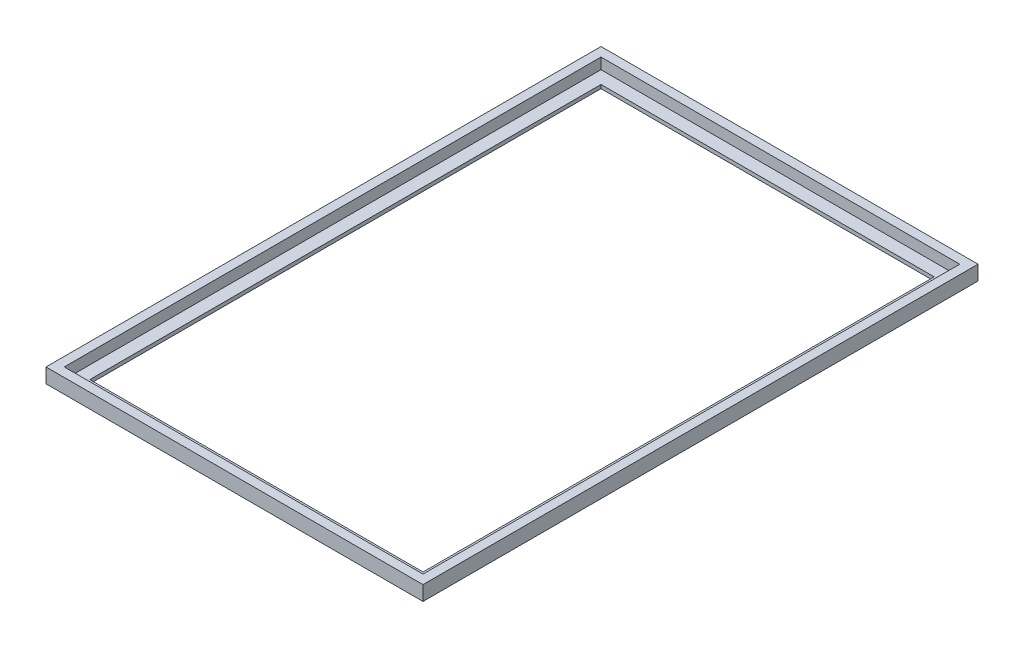
ISO-10303-21;
HEADER;
FILE_DESCRIPTION(('STEP AP214'),'2;1');
FILE_NAME('part.step','',(''),(''),'','','');
FILE_SCHEMA(('AUTOMOTIVE_DESIGN { 1 0 10303 214 1 1 1 1 }'));
ENDSEC;
DATA;
#1=APPLICATION_CONTEXT('core data for automotive mechanical design processes');
#2=APPLICATION_PROTOCOL_DEFINITION('international standard','automotive_design',2000,#1);
#3=PRODUCT_CONTEXT('',#1,'mechanical');
#4=PRODUCT('Part','Part','',(#3));
#5=PRODUCT_RELATED_PRODUCT_CATEGORY('part','',(#4));
#6=PRODUCT_DEFINITION_FORMATION('','',#4);
#7=PRODUCT_DEFINITION_CONTEXT('part definition',#1,'design');
#8=PRODUCT_DEFINITION('design','',#6,#7);
#9=PRODUCT_DEFINITION_SHAPE('','',#8);
#10=(LENGTH_UNIT() NAMED_UNIT(*) SI_UNIT(.MILLI.,.METRE.));
#11=(NAMED_UNIT(*) PLANE_ANGLE_UNIT() SI_UNIT($,.RADIAN.));
#12=(NAMED_UNIT(*) SI_UNIT($,.STERADIAN.) SOLID_ANGLE_UNIT());
#13=UNCERTAINTY_MEASURE_WITH_UNIT(LENGTH_MEASURE(1.E-05),#10,'distance_accuracy_value','');
#14=(GEOMETRIC_REPRESENTATION_CONTEXT(3) GLOBAL_UNCERTAINTY_ASSIGNED_CONTEXT((#13)) GLOBAL_UNIT_ASSIGNED_CONTEXT((#10,
#11,#12)) REPRESENTATION_CONTEXT('',''));
#15=CARTESIAN_POINT('',(0.,0.,0.));
#16=DIRECTION('',(0.,0.,1.));
#17=DIRECTION('',(1.,0.,0.));
#18=AXIS2_PLACEMENT_3D('',#15,#16,#17);
#19=CARTESIAN_POINT('',(0.,2.,0.));
#20=DIRECTION('',(0.,1.,0.));
#21=DIRECTION('',(0.,0.,1.));
#22=AXIS2_PLACEMENT_3D('',#19,#20,#21);
#23=PLANE('',#22);
#24=DIRECTION('',(-1.,0.,0.));
#25=VECTOR('',#24,1.);
#26=CARTESIAN_POINT('',(98.2499999999999,2.,-147.));
#27=LINE('',#26,#25);
#28=CARTESIAN_POINT('',(98.2499999999999,2.,-147.));
#29=VERTEX_POINT('',#28);
#30=CARTESIAN_POINT('',(-98.2500000000001,2.,-147.));
#31=VERTEX_POINT('',#30);
#32=EDGE_CURVE('E53',#29,#31,#27,.T.);
#33=ORIENTED_EDGE('',*,*,#32,.T.);
#34=DIRECTION('',(0.,0.,1.));
#35=VECTOR('',#34,1.);
#36=CARTESIAN_POINT('',(-98.25,2.,-147.));
#37=LINE('',#36,#35);
#38=CARTESIAN_POINT('',(-98.25,2.,147.));
#39=VERTEX_POINT('',#38);
#40=EDGE_CURVE('E57',#31,#39,#37,.T.);
#41=ORIENTED_EDGE('',*,*,#40,.T.);
#42=DIRECTION('',(1.,0.,0.));
#43=VECTOR('',#42,1.);
#44=CARTESIAN_POINT('',(-98.25,2.,147.));
#45=LINE('',#44,#43);
#46=CARTESIAN_POINT('',(98.2499999999999,2.,147.));
#47=VERTEX_POINT('',#46);
#48=EDGE_CURVE('E155',#39,#47,#45,.T.);
#49=ORIENTED_EDGE('',*,*,#48,.T.);
#50=DIRECTION('',(0.,0.,-1.));
#51=VECTOR('',#50,1.);
#52=CARTESIAN_POINT('',(98.2499999999999,2.,147.));
#53=LINE('',#52,#51);
#54=EDGE_CURVE('E136',#47,#29,#53,.T.);
#55=ORIENTED_EDGE('',*,*,#54,.T.);
#56=EDGE_LOOP('',(#33,#41,#49,#55));
#57=FACE_BOUND('',#56,.T.);
#58=DIRECTION('',(1.,0.,0.));
#59=VECTOR('',#58,1.);
#60=CARTESIAN_POINT('',(91.2499999999999,2.,140.));
#61=LINE('',#60,#59);
#62=CARTESIAN_POINT('',(-91.25,2.,140.));
#63=VERTEX_POINT('',#62);
#64=CARTESIAN_POINT('',(91.2499999999999,2.,140.));
#65=VERTEX_POINT('',#64);
#66=EDGE_CURVE('E177',#63,#65,#61,.T.);
#67=ORIENTED_EDGE('',*,*,#66,.F.);
#68=DIRECTION('',(0.,0.,1.));
#69=VECTOR('',#68,1.);
#70=CARTESIAN_POINT('',(-91.25,2.,140.));
#71=LINE('',#70,#69);
#72=CARTESIAN_POINT('',(-91.25,2.,-140.));
#73=VERTEX_POINT('',#72);
#74=EDGE_CURVE('E175',#73,#63,#71,.T.);
#75=ORIENTED_EDGE('',*,*,#74,.F.);
#76=DIRECTION('',(-1.,0.,0.));
#77=VECTOR('',#76,1.);
#78=CARTESIAN_POINT('',(91.2499999999999,2.,-140.));
#79=LINE('',#78,#77);
#80=CARTESIAN_POINT('',(91.2499999999999,2.,-140.));
#81=VERTEX_POINT('',#80);
#82=EDGE_CURVE('E183',#81,#73,#79,.T.);
#83=ORIENTED_EDGE('',*,*,#82,.F.);
#84=DIRECTION('',(0.,0.,-1.));
#85=VECTOR('',#84,1.);
#86=CARTESIAN_POINT('',(91.2499999999999,2.,140.));
#87=LINE('',#86,#85);
#88=EDGE_CURVE('E180',#65,#81,#87,.T.);
#89=ORIENTED_EDGE('',*,*,#88,.F.);
#90=EDGE_LOOP('',(#67,#75,#83,#89));
#91=FACE_BOUND('',#90,.T.);
#92=ADVANCED_FACE('F38',(#57,#91),#23,.T.);
#93=CARTESIAN_POINT('',(0.,0.,0.));
#94=DIRECTION('',(0.,1.,0.));
#95=DIRECTION('',(0.,0.,1.));
#96=AXIS2_PLACEMENT_3D('',#93,#94,#95);
#97=PLANE('',#96);
#98=DIRECTION('',(0.,0.,1.));
#99=VECTOR('',#98,1.);
#100=CARTESIAN_POINT('',(-103.25,0.,152.));
#101=LINE('',#100,#99);
#102=CARTESIAN_POINT('',(-103.25,0.,-152.));
#103=VERTEX_POINT('',#102);
#104=CARTESIAN_POINT('',(-103.25,0.,152.));
#105=VERTEX_POINT('',#104);
#106=EDGE_CURVE('E205',#103,#105,#101,.T.);
#107=ORIENTED_EDGE('',*,*,#106,.F.);
#108=DIRECTION('',(-1.,0.,0.));
#109=VECTOR('',#108,1.);
#110=CARTESIAN_POINT('',(103.25,0.,-152.));
#111=LINE('',#110,#109);
#112=CARTESIAN_POINT('',(103.25,0.,-152.));
#113=VERTEX_POINT('',#112);
#114=EDGE_CURVE('E212',#113,#103,#111,.T.);
#115=ORIENTED_EDGE('',*,*,#114,.F.);
#116=DIRECTION('',(0.,0.,-1.));
#117=VECTOR('',#116,1.);
#118=CARTESIAN_POINT('',(103.25,0.,152.));
#119=LINE('',#118,#117);
#120=CARTESIAN_POINT('',(103.25,0.,152.));
#121=VERTEX_POINT('',#120);
#122=EDGE_CURVE('E210',#121,#113,#119,.T.);
#123=ORIENTED_EDGE('',*,*,#122,.F.);
#124=DIRECTION('',(1.,0.,0.));
#125=VECTOR('',#124,1.);
#126=CARTESIAN_POINT('',(103.25,0.,152.));
#127=LINE('',#126,#125);
#128=EDGE_CURVE('E208',#105,#121,#127,.T.);
#129=ORIENTED_EDGE('',*,*,#128,.F.);
#130=EDGE_LOOP('',(#107,#115,#123,#129));
#131=FACE_BOUND('',#130,.T.);
#132=DIRECTION('',(0.,0.,1.));
#133=VECTOR('',#132,1.);
#134=CARTESIAN_POINT('',(-91.25,0.,140.));
#135=LINE('',#134,#133);
#136=CARTESIAN_POINT('',(-91.25,0.,-140.));
#137=VERTEX_POINT('',#136);
#138=CARTESIAN_POINT('',(-91.25,0.,140.));
#139=VERTEX_POINT('',#138);
#140=EDGE_CURVE('E174',#137,#139,#135,.T.);
#141=ORIENTED_EDGE('',*,*,#140,.T.);
#142=DIRECTION('',(1.,0.,0.));
#143=VECTOR('',#142,1.);
#144=CARTESIAN_POINT('',(91.2499999999999,0.,140.));
#145=LINE('',#144,#143);
#146=CARTESIAN_POINT('',(91.2499999999999,0.,140.));
#147=VERTEX_POINT('',#146);
#148=EDGE_CURVE('E188',#139,#147,#145,.T.);
#149=ORIENTED_EDGE('',*,*,#148,.T.);
#150=DIRECTION('',(0.,0.,-1.));
#151=VECTOR('',#150,1.);
#152=CARTESIAN_POINT('',(91.2499999999999,0.,140.));
#153=LINE('',#152,#151);
#154=CARTESIAN_POINT('',(91.2499999999999,0.,-140.));
#155=VERTEX_POINT('',#154);
#156=EDGE_CURVE('E191',#147,#155,#153,.T.);
#157=ORIENTED_EDGE('',*,*,#156,.T.);
#158=DIRECTION('',(-1.,0.,0.));
#159=VECTOR('',#158,1.);
#160=CARTESIAN_POINT('',(91.2499999999999,0.,-140.));
#161=LINE('',#160,#159);
#162=EDGE_CURVE('E178',#155,#137,#161,.T.);
#163=ORIENTED_EDGE('',*,*,#162,.T.);
#164=EDGE_LOOP('',(#141,#149,#157,#163));
#165=FACE_BOUND('',#164,.T.);
#166=ADVANCED_FACE('F229',(#131,#165),#97,.F.);
#167=CARTESIAN_POINT('',(-103.25,2.,152.));
#168=DIRECTION('',(1.,0.,0.));
#169=DIRECTION('',(0.,0.,-1.));
#170=AXIS2_PLACEMENT_3D('',#167,#168,#169);
#171=PLANE('',#170);
#172=ORIENTED_EDGE('',*,*,#106,.T.);
#173=DIRECTION('',(0.,-1.,0.));
#174=VECTOR('',#173,1.);
#175=CARTESIAN_POINT('',(-103.25,2.,152.));
#176=LINE('',#175,#174);
#177=CARTESIAN_POINT('',(-103.25,8.,152.));
#178=VERTEX_POINT('',#177);
#179=EDGE_CURVE('E11',#178,#105,#176,.T.);
#180=ORIENTED_EDGE('',*,*,#179,.F.);
#181=DIRECTION('',(0.,0.,1.));
#182=VECTOR('',#181,1.);
#183=CARTESIAN_POINT('',(-103.25,8.,-152.));
#184=LINE('',#183,#182);
#185=CARTESIAN_POINT('',(-103.25,8.,-152.));
#186=VERTEX_POINT('',#185);
#187=EDGE_CURVE('E165',#186,#178,#184,.T.);
#188=ORIENTED_EDGE('',*,*,#187,.F.);
#189=DIRECTION('',(0.,-1.,0.));
#190=VECTOR('',#189,1.);
#191=CARTESIAN_POINT('',(-103.25,2.,-152.));
#192=LINE('',#191,#190);
#193=EDGE_CURVE('E214',#186,#103,#192,.T.);
#194=ORIENTED_EDGE('',*,*,#193,.T.);
#195=EDGE_LOOP('',(#172,#180,#188,#194));
#196=FACE_BOUND('',#195,.T.);
#197=ADVANCED_FACE('F40',(#196),#171,.F.);
#198=CARTESIAN_POINT('',(103.25,2.,152.));
#199=DIRECTION('',(0.,0.,-1.));
#200=DIRECTION('',(-1.,0.,0.));
#201=AXIS2_PLACEMENT_3D('',#198,#199,#200);
#202=PLANE('',#201);
#203=ORIENTED_EDGE('',*,*,#128,.T.);
#204=DIRECTION('',(0.,-1.,0.));
#205=VECTOR('',#204,1.);
#206=CARTESIAN_POINT('',(103.25,2.,152.));
#207=LINE('',#206,#205);
#208=CARTESIAN_POINT('',(103.25,8.,152.));
#209=VERTEX_POINT('',#208);
#210=EDGE_CURVE('E46',#209,#121,#207,.T.);
#211=ORIENTED_EDGE('',*,*,#210,.F.);
#212=DIRECTION('',(1.,0.,0.));
#213=VECTOR('',#212,1.);
#214=CARTESIAN_POINT('',(-103.25,8.,152.));
#215=LINE('',#214,#213);
#216=EDGE_CURVE('E168',#178,#209,#215,.T.);
#217=ORIENTED_EDGE('',*,*,#216,.F.);
#218=ORIENTED_EDGE('',*,*,#179,.T.);
#219=EDGE_LOOP('',(#203,#211,#217,#218));
#220=FACE_BOUND('',#219,.T.);
#221=ADVANCED_FACE('F237',(#220),#202,.F.);
#222=CARTESIAN_POINT('',(103.25,2.,152.));
#223=DIRECTION('',(-1.,0.,0.));
#224=DIRECTION('',(0.,0.,1.));
#225=AXIS2_PLACEMENT_3D('',#222,#223,#224);
#226=PLANE('',#225);
#227=ORIENTED_EDGE('',*,*,#122,.T.);
#228=DIRECTION('',(0.,-1.,0.));
#229=VECTOR('',#228,1.);
#230=CARTESIAN_POINT('',(103.25,2.,-152.));
#231=LINE('',#230,#229);
#232=CARTESIAN_POINT('',(103.25,8.,-152.));
#233=VERTEX_POINT('',#232);
#234=EDGE_CURVE('E217',#233,#113,#231,.T.);
#235=ORIENTED_EDGE('',*,*,#234,.F.);
#236=DIRECTION('',(0.,0.,-1.));
#237=VECTOR('',#236,1.);
#238=CARTESIAN_POINT('',(103.25,8.,152.));
#239=LINE('',#238,#237);
#240=EDGE_CURVE('E171',#209,#233,#239,.T.);
#241=ORIENTED_EDGE('',*,*,#240,.F.);
#242=ORIENTED_EDGE('',*,*,#210,.T.);
#243=EDGE_LOOP('',(#227,#235,#241,#242));
#244=FACE_BOUND('',#243,.T.);
#245=ADVANCED_FACE('F223',(#244),#226,.F.);
#246=CARTESIAN_POINT('',(103.25,2.,-152.));
#247=DIRECTION('',(0.,0.,1.));
#248=DIRECTION('',(1.,0.,0.));
#249=AXIS2_PLACEMENT_3D('',#246,#247,#248);
#250=PLANE('',#249);
#251=ORIENTED_EDGE('',*,*,#114,.T.);
#252=ORIENTED_EDGE('',*,*,#193,.F.);
#253=DIRECTION('',(-1.,0.,0.));
#254=VECTOR('',#253,1.);
#255=CARTESIAN_POINT('',(103.25,8.,-152.));
#256=LINE('',#255,#254);
#257=EDGE_CURVE('E141',#233,#186,#256,.T.);
#258=ORIENTED_EDGE('',*,*,#257,.F.);
#259=ORIENTED_EDGE('',*,*,#234,.T.);
#260=EDGE_LOOP('',(#251,#252,#258,#259));
#261=FACE_BOUND('',#260,.T.);
#262=ADVANCED_FACE('F232',(#261),#250,.F.);
#263=CARTESIAN_POINT('',(-91.25,2.,140.));
#264=DIRECTION('',(1.,0.,0.));
#265=DIRECTION('',(0.,0.,-1.));
#266=AXIS2_PLACEMENT_3D('',#263,#264,#265);
#267=PLANE('',#266);
#268=ORIENTED_EDGE('',*,*,#140,.F.);
#269=DIRECTION('',(0.,-1.,0.));
#270=VECTOR('',#269,1.);
#271=CARTESIAN_POINT('',(-91.25,2.,-140.));
#272=LINE('',#271,#270);
#273=EDGE_CURVE('E185',#73,#137,#272,.T.);
#274=ORIENTED_EDGE('',*,*,#273,.F.);
#275=ORIENTED_EDGE('',*,*,#74,.T.);
#276=DIRECTION('',(0.,-1.,0.));
#277=VECTOR('',#276,1.);
#278=CARTESIAN_POINT('',(-91.25,2.,140.));
#279=LINE('',#278,#277);
#280=EDGE_CURVE('E202',#63,#139,#279,.T.);
#281=ORIENTED_EDGE('',*,*,#280,.T.);
#282=EDGE_LOOP('',(#268,#274,#275,#281));
#283=FACE_BOUND('',#282,.T.);
#284=ADVANCED_FACE('F252',(#283),#267,.T.);
#285=CARTESIAN_POINT('',(91.2499999999999,2.,140.));
#286=DIRECTION('',(0.,0.,-1.));
#287=DIRECTION('',(-1.,0.,0.));
#288=AXIS2_PLACEMENT_3D('',#285,#286,#287);
#289=PLANE('',#288);
#290=ORIENTED_EDGE('',*,*,#148,.F.);
#291=ORIENTED_EDGE('',*,*,#280,.F.);
#292=ORIENTED_EDGE('',*,*,#66,.T.);
#293=DIRECTION('',(0.,-1.,0.));
#294=VECTOR('',#293,1.);
#295=CARTESIAN_POINT('',(91.2499999999999,2.,140.));
#296=LINE('',#295,#294);
#297=EDGE_CURVE('E200',#65,#147,#296,.T.);
#298=ORIENTED_EDGE('',*,*,#297,.T.);
#299=EDGE_LOOP('',(#290,#291,#292,#298));
#300=FACE_BOUND('',#299,.T.);
#301=ADVANCED_FACE('F259',(#300),#289,.T.);
#302=CARTESIAN_POINT('',(91.2499999999999,2.,140.));
#303=DIRECTION('',(-1.,0.,0.));
#304=DIRECTION('',(0.,0.,1.));
#305=AXIS2_PLACEMENT_3D('',#302,#303,#304);
#306=PLANE('',#305);
#307=ORIENTED_EDGE('',*,*,#156,.F.);
#308=ORIENTED_EDGE('',*,*,#297,.F.);
#309=ORIENTED_EDGE('',*,*,#88,.T.);
#310=DIRECTION('',(0.,-1.,0.));
#311=VECTOR('',#310,1.);
#312=CARTESIAN_POINT('',(91.2499999999999,2.,-140.));
#313=LINE('',#312,#311);
#314=EDGE_CURVE('E198',#81,#155,#313,.T.);
#315=ORIENTED_EDGE('',*,*,#314,.T.);
#316=EDGE_LOOP('',(#307,#308,#309,#315));
#317=FACE_BOUND('',#316,.T.);
#318=ADVANCED_FACE('F264',(#317),#306,.T.);
#319=CARTESIAN_POINT('',(91.2499999999999,2.,-140.));
#320=DIRECTION('',(0.,0.,1.));
#321=DIRECTION('',(1.,0.,0.));
#322=AXIS2_PLACEMENT_3D('',#319,#320,#321);
#323=PLANE('',#322);
#324=ORIENTED_EDGE('',*,*,#162,.F.);
#325=ORIENTED_EDGE('',*,*,#314,.F.);
#326=ORIENTED_EDGE('',*,*,#82,.T.);
#327=ORIENTED_EDGE('',*,*,#273,.T.);
#328=EDGE_LOOP('',(#324,#325,#326,#327));
#329=FACE_BOUND('',#328,.T.);
#330=ADVANCED_FACE('F271',(#329),#323,.T.);
#331=CARTESIAN_POINT('',(0.,8.,0.));
#332=DIRECTION('',(0.,1.,0.));
#333=DIRECTION('',(0.,0.,1.));
#334=AXIS2_PLACEMENT_3D('',#331,#332,#333);
#335=PLANE('',#334);
#336=ORIENTED_EDGE('',*,*,#257,.T.);
#337=ORIENTED_EDGE('',*,*,#187,.T.);
#338=ORIENTED_EDGE('',*,*,#216,.T.);
#339=ORIENTED_EDGE('',*,*,#240,.T.);
#340=EDGE_LOOP('',(#336,#337,#338,#339));
#341=FACE_BOUND('',#340,.T.);
#342=DIRECTION('',(0.,0.,1.));
#343=VECTOR('',#342,1.);
#344=CARTESIAN_POINT('',(-98.25,8.,-147.));
#345=LINE('',#344,#343);
#346=CARTESIAN_POINT('',(-98.25,8.,-147.));
#347=VERTEX_POINT('',#346);
#348=CARTESIAN_POINT('',(-98.25,8.,147.));
#349=VERTEX_POINT('',#348);
#350=EDGE_CURVE('E135',#347,#349,#345,.T.);
#351=ORIENTED_EDGE('',*,*,#350,.F.);
#352=DIRECTION('',(-1.,0.,0.));
#353=VECTOR('',#352,1.);
#354=CARTESIAN_POINT('',(98.2499999999999,8.,-147.));
#355=LINE('',#354,#353);
#356=CARTESIAN_POINT('',(98.2499999999999,8.,-147.));
#357=VERTEX_POINT('',#356);
#358=EDGE_CURVE('E126',#357,#347,#355,.T.);
#359=ORIENTED_EDGE('',*,*,#358,.F.);
#360=DIRECTION('',(0.,0.,-1.));
#361=VECTOR('',#360,1.);
#362=CARTESIAN_POINT('',(98.2499999999999,8.,147.));
#363=LINE('',#362,#361);
#364=CARTESIAN_POINT('',(98.2499999999999,8.,147.));
#365=VERTEX_POINT('',#364);
#366=EDGE_CURVE('E149',#365,#357,#363,.T.);
#367=ORIENTED_EDGE('',*,*,#366,.F.);
#368=DIRECTION('',(1.,0.,0.));
#369=VECTOR('',#368,1.);
#370=CARTESIAN_POINT('',(-98.25,8.,147.));
#371=LINE('',#370,#369);
#372=EDGE_CURVE('E147',#349,#365,#371,.T.);
#373=ORIENTED_EDGE('',*,*,#372,.F.);
#374=EDGE_LOOP('',(#351,#359,#367,#373));
#375=FACE_BOUND('',#374,.T.);
#376=ADVANCED_FACE('F145',(#341,#375),#335,.T.);
#377=CARTESIAN_POINT('',(98.2499999999999,8.,-147.));
#378=DIRECTION('',(0.,0.,1.));
#379=DIRECTION('',(1.,0.,0.));
#380=AXIS2_PLACEMENT_3D('',#377,#378,#379);
#381=PLANE('',#380);
#382=ORIENTED_EDGE('',*,*,#32,.F.);
#383=DIRECTION('',(0.,-1.,0.));
#384=VECTOR('',#383,1.);
#385=CARTESIAN_POINT('',(98.2499999999999,8.,-147.));
#386=LINE('',#385,#384);
#387=EDGE_CURVE('E131',#357,#29,#386,.T.);
#388=ORIENTED_EDGE('',*,*,#387,.F.);
#389=ORIENTED_EDGE('',*,*,#358,.T.);
#390=DIRECTION('',(0.,-1.,0.));
#391=VECTOR('',#390,1.);
#392=CARTESIAN_POINT('',(-98.25,8.,-147.));
#393=LINE('',#392,#391);
#394=EDGE_CURVE('E129',#347,#31,#393,.T.);
#395=ORIENTED_EDGE('',*,*,#394,.T.);
#396=EDGE_LOOP('',(#382,#388,#389,#395));
#397=FACE_BOUND('',#396,.T.);
#398=ADVANCED_FACE('F128',(#397),#381,.T.);
#399=CARTESIAN_POINT('',(-98.25,8.,-147.));
#400=DIRECTION('',(1.,0.,0.));
#401=DIRECTION('',(0.,0.,-1.));
#402=AXIS2_PLACEMENT_3D('',#399,#400,#401);
#403=PLANE('',#402);
#404=ORIENTED_EDGE('',*,*,#40,.F.);
#405=ORIENTED_EDGE('',*,*,#394,.F.);
#406=ORIENTED_EDGE('',*,*,#350,.T.);
#407=DIRECTION('',(0.,-1.,0.));
#408=VECTOR('',#407,1.);
#409=CARTESIAN_POINT('',(-98.25,8.,147.));
#410=LINE('',#409,#408);
#411=EDGE_CURVE('E142',#349,#39,#410,.T.);
#412=ORIENTED_EDGE('',*,*,#411,.T.);
#413=EDGE_LOOP('',(#404,#405,#406,#412));
#414=FACE_BOUND('',#413,.T.);
#415=ADVANCED_FACE('F139',(#414),#403,.T.);
#416=CARTESIAN_POINT('',(-98.25,8.,147.));
#417=DIRECTION('',(0.,0.,-1.));
#418=DIRECTION('',(-1.,0.,0.));
#419=AXIS2_PLACEMENT_3D('',#416,#417,#418);
#420=PLANE('',#419);
#421=ORIENTED_EDGE('',*,*,#48,.F.);
#422=ORIENTED_EDGE('',*,*,#411,.F.);
#423=ORIENTED_EDGE('',*,*,#372,.T.);
#424=DIRECTION('',(0.,-1.,0.));
#425=VECTOR('',#424,1.);
#426=CARTESIAN_POINT('',(98.2499999999999,8.,147.));
#427=LINE('',#426,#425);
#428=EDGE_CURVE('E159',#365,#47,#427,.T.);
#429=ORIENTED_EDGE('',*,*,#428,.T.);
#430=EDGE_LOOP('',(#421,#422,#423,#429));
#431=FACE_BOUND('',#430,.T.);
#432=ADVANCED_FACE('F291',(#431),#420,.T.);
#433=CARTESIAN_POINT('',(98.2499999999999,8.,147.));
#434=DIRECTION('',(-1.,0.,0.));
#435=DIRECTION('',(0.,0.,1.));
#436=AXIS2_PLACEMENT_3D('',#433,#434,#435);
#437=PLANE('',#436);
#438=ORIENTED_EDGE('',*,*,#54,.F.);
#439=ORIENTED_EDGE('',*,*,#428,.F.);
#440=ORIENTED_EDGE('',*,*,#366,.T.);
#441=ORIENTED_EDGE('',*,*,#387,.T.);
#442=EDGE_LOOP('',(#438,#439,#440,#441));
#443=FACE_BOUND('',#442,.T.);
#444=ADVANCED_FACE('F294',(#443),#437,.T.);
#445=CLOSED_SHELL('',(#92,#166,#197,#221,#245,#262,#284,#301,#318,#330,#376,#398,#415,#432,#444));
#446=MANIFOLD_SOLID_BREP('B2',#445);
#447=ADVANCED_BREP_SHAPE_REPRESENTATION('',(#18,#446),#14);
#448=SHAPE_DEFINITION_REPRESENTATION(#9,#447);
ENDSEC;
END-ISO-10303-21;
